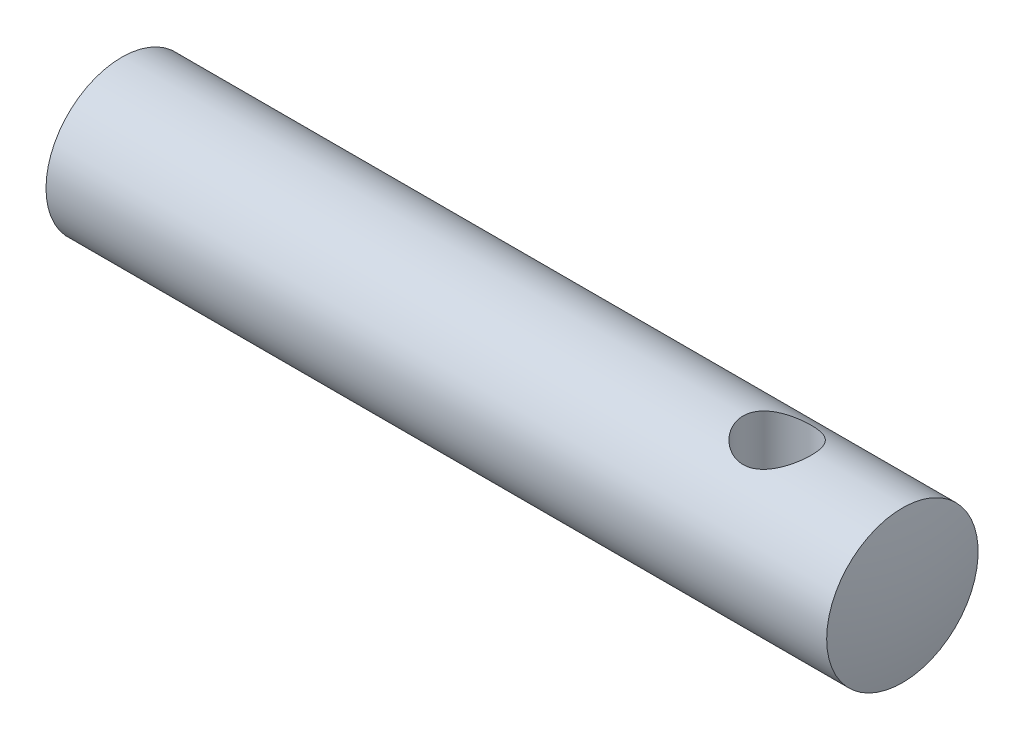
ISO-10303-21;
HEADER;
FILE_DESCRIPTION(('STEP AP214'),'2;1');
FILE_NAME('part.step','',(''),(''),'','','');
FILE_SCHEMA(('AUTOMOTIVE_DESIGN { 1 0 10303 214 1 1 1 1 }'));
ENDSEC;
DATA;
#1=APPLICATION_CONTEXT('core data for automotive mechanical design processes');
#2=APPLICATION_PROTOCOL_DEFINITION('international standard','automotive_design',2000,#1);
#3=PRODUCT_CONTEXT('',#1,'mechanical');
#4=PRODUCT('Part','Part','',(#3));
#5=PRODUCT_RELATED_PRODUCT_CATEGORY('part','',(#4));
#6=PRODUCT_DEFINITION_FORMATION('','',#4);
#7=PRODUCT_DEFINITION_CONTEXT('part definition',#1,'design');
#8=PRODUCT_DEFINITION('design','',#6,#7);
#9=PRODUCT_DEFINITION_SHAPE('','',#8);
#10=(LENGTH_UNIT() NAMED_UNIT(*) SI_UNIT(.MILLI.,.METRE.));
#11=(NAMED_UNIT(*) PLANE_ANGLE_UNIT() SI_UNIT($,.RADIAN.));
#12=(NAMED_UNIT(*) SI_UNIT($,.STERADIAN.) SOLID_ANGLE_UNIT());
#13=UNCERTAINTY_MEASURE_WITH_UNIT(LENGTH_MEASURE(1.E-05),#10,'distance_accuracy_value','');
#14=(GEOMETRIC_REPRESENTATION_CONTEXT(3) GLOBAL_UNCERTAINTY_ASSIGNED_CONTEXT((#13)) GLOBAL_UNIT_ASSIGNED_CONTEXT((#10,
#11,#12)) REPRESENTATION_CONTEXT('',''));
#15=CARTESIAN_POINT('',(0.,0.,0.));
#16=DIRECTION('',(0.,0.,1.));
#17=DIRECTION('',(1.,0.,0.));
#18=AXIS2_PLACEMENT_3D('',#15,#16,#17);
#19=CARTESIAN_POINT('',(-10.5,0.,0.));
#20=DIRECTION('',(-1.,0.,0.));
#21=DIRECTION('',(0.,0.,1.));
#22=AXIS2_PLACEMENT_3D('',#19,#20,#21);
#23=CYLINDRICAL_SURFACE('',#22,2.);
#24=CARTESIAN_POINT('',(6.1,-2.,0.));
#25=CARTESIAN_POINT('',(6.10000569311109,-1.99999559573475,-0.0478725248929914));
#26=CARTESIAN_POINT('',(6.10384147769339,-1.99826206302632,-0.0958014745882849));
#27=CARTESIAN_POINT('',(6.11903889960719,-1.99149409077491,-0.190285729809999));
#28=CARTESIAN_POINT('',(6.1304182811484,-1.98645186874655,-0.236837525619153));
#29=CARTESIAN_POINT('',(6.1601835453443,-1.97360395282095,-0.327040048143755));
#30=CARTESIAN_POINT('',(6.17854418845565,-1.9658082208944,-0.370700567837269));
#31=CARTESIAN_POINT('',(6.22163741385351,-1.94819470518968,-0.454272821766667));
#32=CARTESIAN_POINT('',(6.2463686397978,-1.93837735191815,-0.494185351510959));
#33=CARTESIAN_POINT('',(6.30297191850646,-1.91706180580558,-0.571456721415783));
#34=CARTESIAN_POINT('',(6.33514739477652,-1.90550290395878,-0.608576348409195));
#35=CARTESIAN_POINT('',(6.40508095418557,-1.88224373667121,-0.677104556608048));
#36=CARTESIAN_POINT('',(6.44284242358278,-1.87054338946409,-0.708509647697765));
#37=CARTESIAN_POINT('',(6.52559151929464,-1.84753723683637,-0.76657674290129));
#38=CARTESIAN_POINT('',(6.57087556235643,-1.8362964240249,-0.7928448996406));
#39=CARTESIAN_POINT('',(6.66579258292298,-1.81646629893863,-0.837285305067862));
#40=CARTESIAN_POINT('',(6.7154229404539,-1.80787540321859,-0.855462391424647));
#41=CARTESIAN_POINT('',(6.81487728735139,-1.79498597542642,-0.882176883081344));
#42=CARTESIAN_POINT('',(6.8645491299237,-1.79048255491127,-0.891177610479025));
#43=CARTESIAN_POINT('',(6.96488616019949,-1.78570148822226,-0.900722968572567));
#44=CARTESIAN_POINT('',(7.0155506339689,-1.78542090903246,-0.901273468462257));
#45=CARTESIAN_POINT('',(7.11143277672975,-1.788946853537,-0.894247656746025));
#46=CARTESIAN_POINT('',(7.15672178269298,-1.79237875774226,-0.887416303016286));
#47=CARTESIAN_POINT('',(7.24542479057596,-1.80230090407258,-0.867085943778494));
#48=CARTESIAN_POINT('',(7.28883835446391,-1.8087918565037,-0.853585389657765));
#49=CARTESIAN_POINT('',(7.37373546615401,-1.82425136174881,-0.820032558640753));
#50=CARTESIAN_POINT('',(7.41515310599873,-1.83327265790151,-0.799838931837949));
#51=CARTESIAN_POINT('',(7.49418963790422,-1.85276915187715,-0.753575300019879));
#52=CARTESIAN_POINT('',(7.53180690361054,-1.86324496764067,-0.72750279445865));
#53=CARTESIAN_POINT('',(7.60614026970979,-1.88574317721208,-0.667164525898168));
#54=CARTESIAN_POINT('',(7.6423889525584,-1.89781539704791,-0.632339763954811));
#55=CARTESIAN_POINT('',(7.70870333486021,-1.92127485702889,-0.557008642206518));
#56=CARTESIAN_POINT('',(7.73876707150076,-1.93266187891562,-0.516500485596674));
#57=CARTESIAN_POINT('',(7.79270551014126,-1.95390571095187,-0.429329335741269));
#58=CARTESIAN_POINT('',(7.8163596262318,-1.96370418754186,-0.382514545758533));
#59=CARTESIAN_POINT('',(7.85528718858197,-1.98020289515874,-0.285015927084664));
#60=CARTESIAN_POINT('',(7.8705660521615,-1.98690512846993,-0.234334623578011));
#61=CARTESIAN_POINT('',(7.89126080264735,-1.99606277240222,-0.13442037111822));
#62=CARTESIAN_POINT('',(7.89730204412909,-1.99878682260892,-0.0853416501604275));
#63=CARTESIAN_POINT('',(7.90125174950682,-2.00056259314292,0.0132011419838461));
#64=CARTESIAN_POINT('',(7.89916306963691,-1.99961560319413,0.0626650717432675));
#65=CARTESIAN_POINT('',(7.88733098868985,-1.99432489274835,0.157442558841075));
#66=CARTESIAN_POINT('',(7.87805355135351,-1.99018801278914,0.202827257250812));
#67=CARTESIAN_POINT('',(7.85278674812787,-1.97917064353849,0.291330468497184));
#68=CARTESIAN_POINT('',(7.83679657382121,-1.97228982379838,0.334448707679322));
#69=CARTESIAN_POINT('',(7.79805418153591,-1.95616238241486,0.418721313779312));
#70=CARTESIAN_POINT('',(7.77510703030341,-1.9468488060817,0.459772819669234));
#71=CARTESIAN_POINT('',(7.72331446311463,-1.92681444366068,0.537590218495675));
#72=CARTESIAN_POINT('',(7.69446646715745,-1.91609304277245,0.574354225750077));
#73=CARTESIAN_POINT('',(7.62892386666356,-1.89328435226565,0.64574932534351));
#74=CARTESIAN_POINT('',(7.59177853318217,-1.88115731426163,0.679954942410559));
#75=CARTESIAN_POINT('',(7.51213577443963,-1.85764286796814,0.741795106692086));
#76=CARTESIAN_POINT('',(7.46963630588359,-1.84625574457997,0.769427133541621));
#77=CARTESIAN_POINT('',(7.37903520244581,-1.82528920541918,0.817947508938712));
#78=CARTESIAN_POINT('',(7.33081803398415,-1.81576350909665,0.838645180456886));
#79=CARTESIAN_POINT('',(7.231013448111,-1.8002639506831,0.871426571815613));
#80=CARTESIAN_POINT('',(7.17942949428296,-1.79428650031589,0.883518996454448));
#81=CARTESIAN_POINT('',(7.07914103514642,-1.7871711144668,0.897818115951413));
#82=CARTESIAN_POINT('',(7.03057155581943,-1.78566046401411,0.900787034693371));
#83=CARTESIAN_POINT('',(6.93363574056695,-1.78663307328755,0.898857064311231));
#84=CARTESIAN_POINT('',(6.88526936081126,-1.78911542163469,0.89395997055956));
#85=CARTESIAN_POINT('',(6.79329287103259,-1.79743086544996,0.877109381327632));
#86=CARTESIAN_POINT('',(6.74957533441946,-1.80304232525896,0.865621312886736));
#87=CARTESIAN_POINT('',(6.66469721276032,-1.81677488666874,0.836413748965478));
#88=CARTESIAN_POINT('',(6.62353737587234,-1.82489671847192,0.818692440189258));
#89=CARTESIAN_POINT('',(6.5420229657205,-1.84338394698138,0.776211578243838));
#90=CARTESIAN_POINT('',(6.50189288155187,-1.85386052107309,0.751070764202584));
#91=CARTESIAN_POINT('',(6.42618482710568,-1.87561898638988,0.69495226565004));
#92=CARTESIAN_POINT('',(6.39060882882443,-1.88690122320851,0.66397206684598));
#93=CARTESIAN_POINT('',(6.32168692730181,-1.91022586678707,0.593738464112257));
#94=CARTESIAN_POINT('',(6.28883508575892,-1.92224453709829,0.553989806112905));
#95=CARTESIAN_POINT('',(6.23021024786519,-1.94469569058837,0.469129578382193));
#96=CARTESIAN_POINT('',(6.20444050732235,-1.95512744324335,0.424015555675807));
#97=CARTESIAN_POINT('',(6.16111189799205,-1.97315703073845,0.330027757217581));
#98=CARTESIAN_POINT('',(6.14347369485286,-1.98078209424092,0.281195970855564));
#99=CARTESIAN_POINT('',(6.11685602837172,-1.99243482656813,0.180915930570614));
#100=CARTESIAN_POINT('',(6.10785030507436,-1.99647340269278,0.12947611620236));
#101=CARTESIAN_POINT('',(6.10111694951615,-1.9994977296572,0.0518304892955525));
#102=CARTESIAN_POINT('',(6.0999969171155,-2.0000023849598,0.0259235174995349));
#103=CARTESIAN_POINT('',(6.1,-2.,0.));
#104=B_SPLINE_CURVE_WITH_KNOTS('',3,(#24,#25,#26,#27,#28,#29,#30,#31,#32,#33,#34,#35,#36,#37,
#38,#39,#40,#41,#42,#43,#44,#45,#46,#47,#48,#49,#50,#51,#52,#53,#54,#55,#56,#57,#58,#59,#60,#61,
#62,#63,#64,#65,#66,#67,#68,#69,#70,#71,#72,#73,#74,#75,#76,#77,#78,#79,#80,#81,#82,#83,#84,#85,
#86,#87,#88,#89,#90,#91,#92,#93,#94,#95,#96,#97,#98,#99,#100,#101,#102,#103),.UNSPECIFIED.,.T.,
.F.,(4,2,2,2,2,2,2,2,2,2,2,2,2,2,2,2,2,2,2,2,2,2,2,2,2,2,2,2,2,2,2,2,2,2,2,2,2,2,2,4),(0.,
0.143535389618145,0.287409609954513,0.430768548938867,0.574096990980359,0.724846356160329,
0.875687483755546,1.03551169359635,1.1952402154087,1.34643101303625,1.49751679475995,
1.63466596166621,1.77184699008983,1.91213238551583,2.05247756343445,2.20687604512583,
2.36132345034474,2.5205555523977,2.67968453729914,2.82747182205959,2.9752071903307,
3.11409411204464,3.25299776476157,3.39622371881134,3.53951242929873,3.69460995380085,
3.84976684839061,4.00889442703943,4.16786080751045,4.31312579365879,4.45835762861477,
4.59441266060441,4.7305073047915,4.87540926455941,5.02037375859778,5.17847194367928,
5.33664268908488,5.49323578382498,5.64935099716367,5.72707704551574),.UNSPECIFIED.);
#105=CARTESIAN_POINT('',(6.1,-2.,0.));
#106=VERTEX_POINT('',#105);
#107=EDGE_CURVE('E10',#106,#106,#104,.T.);
#108=ORIENTED_EDGE('',*,*,#107,.F.);
#109=EDGE_LOOP('',(#108));
#110=FACE_BOUND('',#109,.T.);
#111=CARTESIAN_POINT('',(7.,1.78605710994917,0.900000000000001));
#112=CARTESIAN_POINT('',(7.04759451310632,1.78606338167853,0.899993904872531));
#113=CARTESIAN_POINT('',(7.09524860183964,1.78798753333791,0.896200889187129));
#114=CARTESIAN_POINT('',(7.18915657214398,1.79543069887251,0.881188698473985));
#115=CARTESIAN_POINT('',(7.23540665684361,1.80095868462874,0.869950988465885));
#116=CARTESIAN_POINT('',(7.32496710644055,1.81484257249622,0.840599008940144));
#117=CARTESIAN_POINT('',(7.3682897778369,1.82318562070555,0.822515951116449));
#118=CARTESIAN_POINT('',(7.45127610926539,1.84174115190354,0.780079367805812));
#119=CARTESIAN_POINT('',(7.49094021459244,1.85195340693276,0.755726606794495));
#120=CARTESIAN_POINT('',(7.56839396429472,1.87392676776757,0.699546711070864));
#121=CARTESIAN_POINT('',(7.60588598993606,1.88574564470359,0.667331674041416));
#122=CARTESIAN_POINT('',(7.67515961531454,1.90912956292408,0.597153263851515));
#123=CARTESIAN_POINT('',(7.70693878915998,1.92069449455256,0.559187461249459));
#124=CARTESIAN_POINT('',(7.76549432417132,1.94298992227222,0.476161359501933));
#125=CARTESIAN_POINT('',(7.79192390290032,1.95364558316684,0.430834539343587));
#126=CARTESIAN_POINT('',(7.83665079121629,1.97219898029653,0.33581040429662));
#127=CARTESIAN_POINT('',(7.85495228270114,1.98009813430407,0.28611535266462));
#128=CARTESIAN_POINT('',(7.88178749156512,1.99183646737535,0.186901452751727));
#129=CARTESIAN_POINT('',(7.89083767787753,1.99588928212587,0.13754811242134));
#130=CARTESIAN_POINT('',(7.90059442446108,2.0002624891057,0.0378686070773542));
#131=CARTESIAN_POINT('',(7.90130497553686,2.00058466657332,-0.0124570810842983));
#132=CARTESIAN_POINT('',(7.89460615403454,1.99757696729492,-0.108849972245189));
#133=CARTESIAN_POINT('',(7.88776788211178,1.99450393840056,-0.154966492998641));
#134=CARTESIAN_POINT('',(7.86716072592109,1.98541747030715,-0.245315383693988));
#135=CARTESIAN_POINT('',(7.85339132801404,1.97940381319038,-0.289547613734816));
#136=CARTESIAN_POINT('',(7.81916877977101,1.96489045613952,-0.375691598160863));
#137=CARTESIAN_POINT('',(7.79861728538651,1.95635438264071,-0.417557901504178));
#138=CARTESIAN_POINT('',(7.75152148194837,1.93760635143006,-0.497357287702658));
#139=CARTESIAN_POINT('',(7.72497498169358,1.92739378132494,-0.535288925003648));
#140=CARTESIAN_POINT('',(7.66417766571195,1.90532592563194,-0.609380701173243));
#141=CARTESIAN_POINT('',(7.62947967066002,1.89340458186776,-0.645154693729103));
#142=CARTESIAN_POINT('',(7.5545970797868,1.86984371630062,-0.710559970434975));
#143=CARTESIAN_POINT('',(7.51440963671593,1.85820434446292,-0.740188046622067));
#144=CARTESIAN_POINT('',(7.42750572978868,1.83600756729651,-0.793695924071004));
#145=CARTESIAN_POINT('',(7.38058102519842,1.8255194409972,-0.817268860971868));
#146=CARTESIAN_POINT('',(7.28283438116233,1.80767749679039,-0.856015337124758));
#147=CARTESIAN_POINT('',(7.23201579981238,1.80032101325333,-0.871196023095029));
#148=CARTESIAN_POINT('',(7.13180250447131,1.79027082406952,-0.891656994529559));
#149=CARTESIAN_POINT('',(7.08256744774748,1.78728031131522,-0.897569748987038));
#150=CARTESIAN_POINT('',(6.98372827597207,1.78544905415977,-0.901208969880136));
#151=CARTESIAN_POINT('',(6.93412433892559,1.78660642332847,-0.898939157691919));
#152=CARTESIAN_POINT('',(6.84015993404945,1.79263003607399,-0.886856864654279));
#153=CARTESIAN_POINT('',(6.79569767608844,1.79719184172154,-0.877662975422487));
#154=CARTESIAN_POINT('',(6.70900013816181,1.80909769961321,-0.852850169677464));
#155=CARTESIAN_POINT('',(6.66676544386526,1.81644247944124,-0.83722957286682));
#156=CARTESIAN_POINT('',(6.58358073168821,1.83348592527057,-0.799237138333728));
#157=CARTESIAN_POINT('',(6.5427746540212,1.84327584388849,-0.776592491950458));
#158=CARTESIAN_POINT('',(6.46532655447212,1.86399582272393,-0.725451711556348));
#159=CARTESIAN_POINT('',(6.42868653164192,1.87492642550656,-0.696952786665905));
#160=CARTESIAN_POINT('',(6.35686978482374,1.89798533781934,-0.631635509686239));
#161=CARTESIAN_POINT('',(6.32218724192977,1.91012616661146,-0.594275910014916));
#162=CARTESIAN_POINT('',(6.25946938244304,1.9332704992432,-0.514011989746335));
#163=CARTESIAN_POINT('',(6.23143511111179,1.94427382408779,-0.471106798890534));
#164=CARTESIAN_POINT('',(6.18264154337348,1.96407017158726,-0.380272883636553));
#165=CARTESIAN_POINT('',(6.16195748694447,1.97284008802807,-0.332298381010361));
#166=CARTESIAN_POINT('',(6.12912950055414,1.98700633430142,-0.233047815748496));
#167=CARTESIAN_POINT('',(6.11697954957101,1.99240504230559,-0.181774108719045));
#168=CARTESIAN_POINT('',(6.10241158300916,1.99890645397916,-0.081757925542334));
#169=CARTESIAN_POINT('',(6.09930006472273,2.0003150723876,-0.0331358435645495));
#170=CARTESIAN_POINT('',(6.10096352484713,1.9995663192658,0.0639393119822136));
#171=CARTESIAN_POINT('',(6.10573667517526,1.99740977432866,0.112392422117788));
#172=CARTESIAN_POINT('',(6.12254094270693,1.9899452279521,0.205419795030558));
#173=CARTESIAN_POINT('',(6.13422578172864,1.98478776285301,0.250069779822176));
#174=CARTESIAN_POINT('',(6.1641113519619,1.97193518813126,0.33673810171844));
#175=CARTESIAN_POINT('',(6.18231320560349,1.964239641391,0.378755984028591));
#176=CARTESIAN_POINT('',(6.22562989053194,1.94659715338735,0.461100677624792));
#177=CARTESIAN_POINT('',(6.25102315852538,1.93656323977839,0.501261896017324));
#178=CARTESIAN_POINT('',(6.30762241848462,1.91538465361302,0.576929844379539));
#179=CARTESIAN_POINT('',(6.33883091648523,1.90423950314277,0.612434556376684));
#180=CARTESIAN_POINT('',(6.40913352652085,1.88094034143955,0.680786789817284));
#181=CARTESIAN_POINT('',(6.4486614024068,1.86877767626613,0.713186761450655));
#182=CARTESIAN_POINT('',(6.53290985128513,1.84568017521229,0.770997488724106));
#183=CARTESIAN_POINT('',(6.57763373637009,1.83474613132311,0.796403751217172));
#184=CARTESIAN_POINT('',(6.67152458163385,1.81542690284033,0.839517050419588));
#185=CARTESIAN_POINT('',(6.72071678833309,1.80705754106676,0.857176570884019));
#186=CARTESIAN_POINT('',(6.82179888920627,1.79423274699449,0.883716361106234));
#187=CARTESIAN_POINT('',(6.87367910557254,1.7897641842428,0.892626096216153));
#188=CARTESIAN_POINT('',(6.95057325839119,1.7865680275393,0.898984642632157));
#189=CARTESIAN_POINT('',(6.97527859261633,1.78605385230525,0.900003165913872));
#190=CARTESIAN_POINT('',(7.,1.78605710994917,0.900000000000001));
#191=B_SPLINE_CURVE_WITH_KNOTS('',3,(#111,#112,#113,#114,#115,#116,#117,#118,#119,#120,#121,
#122,#123,#124,#125,#126,#127,#128,#129,#130,#131,#132,#133,#134,#135,#136,#137,#138,#139,#140,
#141,#142,#143,#144,#145,#146,#147,#148,#149,#150,#151,#152,#153,#154,#155,#156,#157,#158,#159,
#160,#161,#162,#163,#164,#165,#166,#167,#168,#169,#170,#171,#172,#173,#174,#175,#176,#177,#178,
#179,#180,#181,#182,#183,#184,#185,#186,#187,#188,#189,#190),.UNSPECIFIED.,.T.,.F.,(4,2,2,2,2,2,
2,2,2,2,2,2,2,2,2,2,2,2,2,2,2,2,2,2,2,2,2,2,2,2,2,2,2,2,2,2,2,2,2,4),(0.,0.142703897195022,
0.285764424829258,0.428180367939294,0.570578954247401,0.722398407778392,0.874282178053422,
1.03407679431295,1.19378910078847,1.34399687882985,1.49413277430874,1.63364332074006,
1.77316420728406,1.91480430355704,2.05649625394221,2.20955360005846,2.36269063707454,
2.52250293779006,2.68217893421482,2.83039266934072,2.97853900636436,3.11482143159979,
3.25113951127788,3.39360809190202,3.53614474910745,3.69263163774132,3.84914311343323,
4.00721344708392,4.1651721458928,4.31064184199307,4.45607781526714,4.59478006216421,
4.73350620934803,4.87858610046381,5.02372865800169,5.18061690173492,5.33760570518744,
5.49554440847013,5.65294940233066,5.7270722569949),.UNSPECIFIED.);
#192=CARTESIAN_POINT('',(7.,1.78605710994917,0.900000000000001));
#193=VERTEX_POINT('',#192);
#194=EDGE_CURVE('E50',#193,#193,#191,.T.);
#195=ORIENTED_EDGE('',*,*,#194,.F.);
#196=EDGE_LOOP('',(#195));
#197=FACE_BOUND('',#196,.T.);
#198=CARTESIAN_POINT('',(10.3077640640442,0.,0.));
#199=DIRECTION('',(-1.,0.,0.));
#200=DIRECTION('',(0.,0.,1.));
#201=AXIS2_PLACEMENT_3D('',#198,#199,#200);
#202=CIRCLE('',#201,2.);
#203=CARTESIAN_POINT('',(10.3077640640442,0.,2.));
#204=VERTEX_POINT('',#203);
#205=EDGE_CURVE('E54',#204,#204,#202,.T.);
#206=ORIENTED_EDGE('',*,*,#205,.T.);
#207=EDGE_LOOP('',(#206));
#208=FACE_BOUND('',#207,.T.);
#209=CARTESIAN_POINT('',(-10.3077640640442,0.,0.));
#210=DIRECTION('',(-1.,0.,0.));
#211=DIRECTION('',(0.,0.,1.));
#212=AXIS2_PLACEMENT_3D('',#209,#210,#211);
#213=CIRCLE('',#212,2.);
#214=CARTESIAN_POINT('',(-10.3077640640442,0.,2.));
#215=VERTEX_POINT('',#214);
#216=EDGE_CURVE('E58',#215,#215,#213,.T.);
#217=ORIENTED_EDGE('',*,*,#216,.F.);
#218=EDGE_LOOP('',(#217));
#219=FACE_BOUND('',#218,.T.);
#220=ADVANCED_FACE('F39',(#110,#197,#208,#219),#23,.T.);
#221=CARTESIAN_POINT('',(0.,0.,0.));
#222=DIRECTION('',(-1.,0.,0.));
#223=DIRECTION('',(0.,0.,1.));
#224=AXIS2_PLACEMENT_3D('',#221,#222,#223);
#225=SPHERICAL_SURFACE('',#224,10.5);
#226=ORIENTED_EDGE('',*,*,#205,.F.);
#227=EDGE_LOOP('',(#226));
#228=FACE_BOUND('',#227,.T.);
#229=ADVANCED_FACE('F71',(#228),#225,.T.);
#230=CARTESIAN_POINT('',(0.,0.,0.));
#231=DIRECTION('',(-1.,0.,0.));
#232=DIRECTION('',(0.,0.,-1.));
#233=AXIS2_PLACEMENT_3D('',#230,#231,#232);
#234=SPHERICAL_SURFACE('',#233,10.5);
#235=ORIENTED_EDGE('',*,*,#216,.T.);
#236=EDGE_LOOP('',(#235));
#237=FACE_BOUND('',#236,.T.);
#238=ADVANCED_FACE('F68',(#237),#234,.T.);
#239=CARTESIAN_POINT('',(7.,-2.,0.));
#240=DIRECTION('',(0.,1.,0.));
#241=DIRECTION('',(0.,0.,1.));
#242=AXIS2_PLACEMENT_3D('',#239,#240,#241);
#243=CYLINDRICAL_SURFACE('',#242,0.900000000000001);
#244=ORIENTED_EDGE('',*,*,#107,.T.);
#245=EDGE_LOOP('',(#244));
#246=FACE_BOUND('',#245,.T.);
#247=ORIENTED_EDGE('',*,*,#194,.T.);
#248=EDGE_LOOP('',(#247));
#249=FACE_BOUND('',#248,.T.);
#250=ADVANCED_FACE('F64',(#246,#249),#243,.F.);
#251=CLOSED_SHELL('',(#220,#229,#238,#250));
#252=MANIFOLD_SOLID_BREP('B2',#251);
#253=ADVANCED_BREP_SHAPE_REPRESENTATION('',(#18,#252),#14);
#254=SHAPE_DEFINITION_REPRESENTATION(#9,#253);
ENDSEC;
END-ISO-10303-21;
